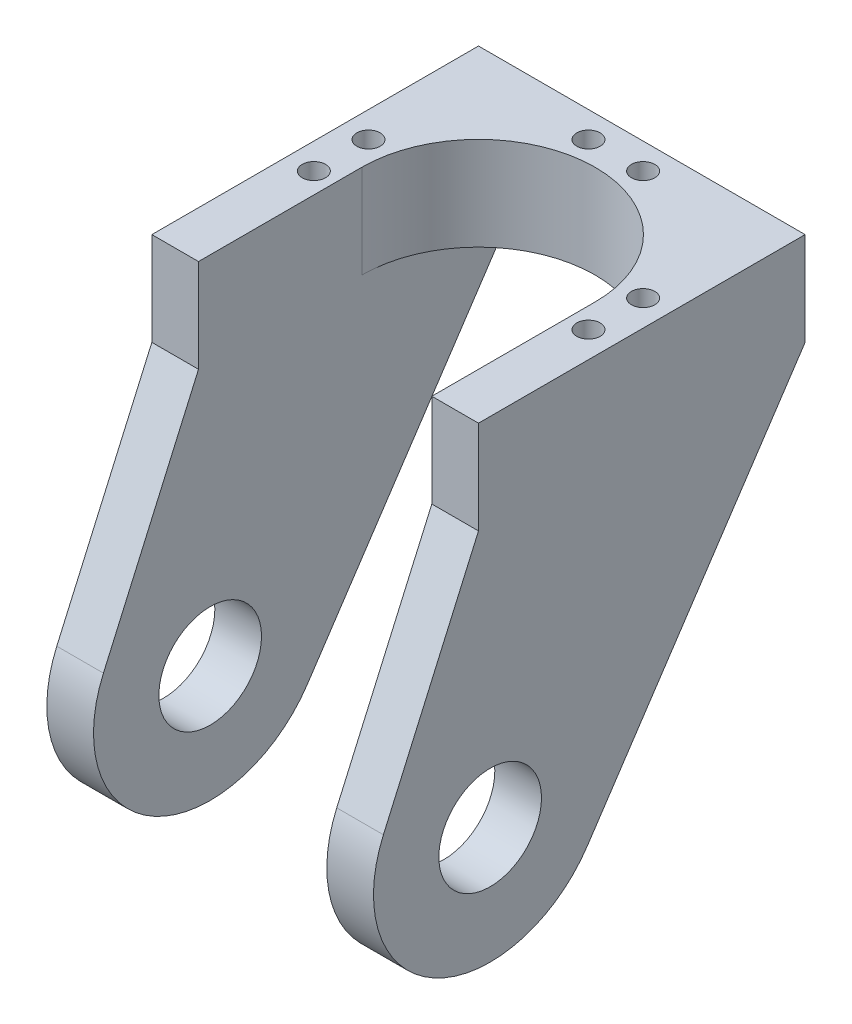
ISO-10303-21;
HEADER;
FILE_DESCRIPTION(('STEP AP214'),'2;1');
FILE_NAME('part.step','',(''),(''),'','','');
FILE_SCHEMA(('AUTOMOTIVE_DESIGN { 1 0 10303 214 1 1 1 1 }'));
ENDSEC;
DATA;
#1=APPLICATION_CONTEXT('core data for automotive mechanical design processes');
#2=APPLICATION_PROTOCOL_DEFINITION('international standard','automotive_design',2000,#1);
#3=PRODUCT_CONTEXT('',#1,'mechanical');
#4=PRODUCT('Part','Part','',(#3));
#5=PRODUCT_RELATED_PRODUCT_CATEGORY('part','',(#4));
#6=PRODUCT_DEFINITION_FORMATION('','',#4);
#7=PRODUCT_DEFINITION_CONTEXT('part definition',#1,'design');
#8=PRODUCT_DEFINITION('design','',#6,#7);
#9=PRODUCT_DEFINITION_SHAPE('','',#8);
#10=(LENGTH_UNIT() NAMED_UNIT(*) SI_UNIT(.MILLI.,.METRE.));
#11=(NAMED_UNIT(*) PLANE_ANGLE_UNIT() SI_UNIT($,.RADIAN.));
#12=(NAMED_UNIT(*) SI_UNIT($,.STERADIAN.) SOLID_ANGLE_UNIT());
#13=UNCERTAINTY_MEASURE_WITH_UNIT(LENGTH_MEASURE(1.E-05),#10,'distance_accuracy_value','');
#14=(GEOMETRIC_REPRESENTATION_CONTEXT(3) GLOBAL_UNCERTAINTY_ASSIGNED_CONTEXT((#13)) GLOBAL_UNIT_ASSIGNED_CONTEXT((#10,
#11,#12)) REPRESENTATION_CONTEXT('',''));
#15=CARTESIAN_POINT('',(0.,0.,0.));
#16=DIRECTION('',(0.,0.,1.));
#17=DIRECTION('',(1.,0.,0.));
#18=AXIS2_PLACEMENT_3D('',#15,#16,#17);
#19=CARTESIAN_POINT('',(-35.,-56.2916512459886,32.4999999999999));
#20=DIRECTION('',(1.,0.,0.));
#21=DIRECTION('',(0.,0.,-1.));
#22=AXIS2_PLACEMENT_3D('',#19,#20,#21);
#23=CYLINDRICAL_SURFACE('',#22,11.);
#24=CARTESIAN_POINT('',(35.,-56.2916512459886,32.4999999999999));
#25=DIRECTION('',(1.,0.,0.));
#26=DIRECTION('',(0.,0.,-1.));
#27=AXIS2_PLACEMENT_3D('',#24,#25,#26);
#28=CIRCLE('',#27,11.);
#29=CARTESIAN_POINT('',(35.,-56.2916512459886,21.4999999999999));
#30=VERTEX_POINT('',#29);
#31=EDGE_CURVE('E272',#30,#30,#28,.T.);
#32=ORIENTED_EDGE('',*,*,#31,.T.);
#33=EDGE_LOOP('',(#32));
#34=FACE_BOUND('',#33,.T.);
#35=CARTESIAN_POINT('',(25.,-56.2916512459886,32.4999999999999));
#36=DIRECTION('',(-1.,0.,0.));
#37=DIRECTION('',(0.,-1.,0.));
#38=AXIS2_PLACEMENT_3D('',#35,#36,#37);
#39=CIRCLE('',#38,11.);
#40=CARTESIAN_POINT('',(25.,-67.2916512459886,32.4999999999999));
#41=VERTEX_POINT('',#40);
#42=EDGE_CURVE('E165',#41,#41,#39,.F.);
#43=ORIENTED_EDGE('',*,*,#42,.F.);
#44=EDGE_LOOP('',(#43));
#45=FACE_BOUND('',#44,.T.);
#46=ADVANCED_FACE('F35',(#34,#45),#23,.F.);
#47=CARTESIAN_POINT('',(-35.,-56.2916512459886,32.4999999999999));
#48=DIRECTION('',(1.,0.,0.));
#49=DIRECTION('',(0.,0.,-1.));
#50=AXIS2_PLACEMENT_3D('',#47,#48,#49);
#51=CYLINDRICAL_SURFACE('',#50,25.);
#52=DIRECTION('',(1.,0.,0.));
#53=VECTOR('',#52,1.);
#54=CARTESIAN_POINT('',(-35.,-46.2046632977982,55.3747169191895));
#55=LINE('',#54,#53);
#56=CARTESIAN_POINT('',(25.,-46.2046632977982,55.3747169191895));
#57=VERTEX_POINT('',#56);
#58=CARTESIAN_POINT('',(35.,-46.2046632977982,55.3747169191895));
#59=VERTEX_POINT('',#58);
#60=EDGE_CURVE('E270',#57,#59,#55,.T.);
#61=ORIENTED_EDGE('',*,*,#60,.F.);
#62=CARTESIAN_POINT('',(25.,-56.2916512459886,32.4999999999999));
#63=DIRECTION('',(-1.,0.,0.));
#64=DIRECTION('',(0.,-1.,0.));
#65=AXIS2_PLACEMENT_3D('',#62,#63,#64);
#66=CIRCLE('',#65,25.);
#67=CARTESIAN_POINT('',(25.,-70.1439483843197,11.6886121560481));
#68=VERTEX_POINT('',#67);
#69=EDGE_CURVE('E210',#57,#68,#66,.F.);
#70=ORIENTED_EDGE('',*,*,#69,.T.);
#71=DIRECTION('',(1.,0.,0.));
#72=VECTOR('',#71,1.);
#73=CARTESIAN_POINT('',(-35.,-70.1439483843197,11.6886121560481));
#74=LINE('',#73,#72);
#75=CARTESIAN_POINT('',(35.,-70.1439483843197,11.6886121560481));
#76=VERTEX_POINT('',#75);
#77=EDGE_CURVE('E269',#68,#76,#74,.T.);
#78=ORIENTED_EDGE('',*,*,#77,.T.);
#79=CARTESIAN_POINT('',(35.,-56.2916512459886,32.4999999999999));
#80=DIRECTION('',(1.,0.,0.));
#81=DIRECTION('',(0.,0.,-1.));
#82=AXIS2_PLACEMENT_3D('',#79,#80,#81);
#83=CIRCLE('',#82,25.);
#84=EDGE_CURVE('E279',#59,#76,#83,.T.);
#85=ORIENTED_EDGE('',*,*,#84,.F.);
#86=EDGE_LOOP('',(#61,#70,#78,#85));
#87=FACE_BOUND('',#86,.T.);
#88=ADVANCED_FACE('F327',(#87),#51,.T.);
#89=CARTESIAN_POINT('',(-35.,-16.1439895834264,-24.2543763835175));
#90=DIRECTION('',(0.,0.554091885533245,0.832455513758071));
#91=DIRECTION('',(0.,-0.832455513758071,0.554091885533245));
#92=AXIS2_PLACEMENT_3D('',#89,#90,#91);
#93=PLANE('',#92);
#94=DIRECTION('',(0.,-0.832455513758071,0.554091885533245));
#95=VECTOR('',#94,1.);
#96=CARTESIAN_POINT('',(25.,-16.1439895834264,-24.2543763835175));
#97=LINE('',#96,#95);
#98=CARTESIAN_POINT('',(25.,0.,-35.));
#99=VERTEX_POINT('',#98);
#100=EDGE_CURVE('E293',#99,#68,#97,.T.);
#101=ORIENTED_EDGE('',*,*,#100,.F.);
#102=DIRECTION('',(1.,0.,0.));
#103=VECTOR('',#102,1.);
#104=CARTESIAN_POINT('',(0.,0.,-35.));
#105=LINE('',#104,#103);
#106=CARTESIAN_POINT('',(35.,0.,-35.));
#107=VERTEX_POINT('',#106);
#108=EDGE_CURVE('E163',#99,#107,#105,.T.);
#109=ORIENTED_EDGE('',*,*,#108,.T.);
#110=DIRECTION('',(0.,-0.832455513758071,0.554091885533245));
#111=VECTOR('',#110,1.);
#112=CARTESIAN_POINT('',(35.,-16.1439895834264,-24.2543763835175));
#113=LINE('',#112,#111);
#114=EDGE_CURVE('E276',#107,#76,#113,.T.);
#115=ORIENTED_EDGE('',*,*,#114,.T.);
#116=ORIENTED_EDGE('',*,*,#77,.F.);
#117=EDGE_LOOP('',(#101,#109,#115,#116));
#118=FACE_BOUND('',#117,.T.);
#119=ADVANCED_FACE('F325',(#118),#93,.F.);
#120=CARTESIAN_POINT('',(-35.,12.9212716573994,29.3021497514515));
#121=DIRECTION('',(0.,-0.403479517927615,-0.914988676767587));
#122=DIRECTION('',(0.,0.914988676767587,-0.403479517927615));
#123=AXIS2_PLACEMENT_3D('',#120,#121,#122);
#124=PLANE('',#123);
#125=DIRECTION('',(0.,0.914988676767587,-0.403479517927615));
#126=VECTOR('',#125,1.);
#127=CARTESIAN_POINT('',(25.,12.9212716573994,29.3021497514515));
#128=LINE('',#127,#126);
#129=CARTESIAN_POINT('',(25.,0.,35.));
#130=VERTEX_POINT('',#129);
#131=EDGE_CURVE('E208',#57,#130,#128,.T.);
#132=ORIENTED_EDGE('',*,*,#131,.F.);
#133=ORIENTED_EDGE('',*,*,#60,.T.);
#134=DIRECTION('',(0.,0.914988676767587,-0.403479517927615));
#135=VECTOR('',#134,1.);
#136=CARTESIAN_POINT('',(35.,12.9212716573994,29.3021497514515));
#137=LINE('',#136,#135);
#138=CARTESIAN_POINT('',(35.,0.,35.));
#139=VERTEX_POINT('',#138);
#140=EDGE_CURVE('E216',#59,#139,#137,.T.);
#141=ORIENTED_EDGE('',*,*,#140,.T.);
#142=DIRECTION('',(1.,0.,0.));
#143=VECTOR('',#142,1.);
#144=CARTESIAN_POINT('',(0.,0.,35.));
#145=LINE('',#144,#143);
#146=EDGE_CURVE('E175',#130,#139,#145,.T.);
#147=ORIENTED_EDGE('',*,*,#146,.F.);
#148=EDGE_LOOP('',(#132,#133,#141,#147));
#149=FACE_BOUND('',#148,.T.);
#150=ADVANCED_FACE('F214',(#149),#124,.F.);
#151=CARTESIAN_POINT('',(0.,20.,0.));
#152=DIRECTION('',(0.,-1.,0.));
#153=DIRECTION('',(0.,0.,-1.));
#154=AXIS2_PLACEMENT_3D('',#151,#152,#153);
#155=CYLINDRICAL_SURFACE('',#154,25.);
#156=CARTESIAN_POINT('',(0.,0.,0.));
#157=DIRECTION('',(0.,1.,0.));
#158=DIRECTION('',(0.,0.,1.));
#159=AXIS2_PLACEMENT_3D('',#156,#157,#158);
#160=CIRCLE('',#159,25.);
#161=CARTESIAN_POINT('',(25.,0.,0.));
#162=VERTEX_POINT('',#161);
#163=CARTESIAN_POINT('',(-25.,0.,0.));
#164=VERTEX_POINT('',#163);
#165=EDGE_CURVE('E153',#162,#164,#160,.T.);
#166=ORIENTED_EDGE('',*,*,#165,.F.);
#167=DIRECTION('',(0.,-1.,0.));
#168=VECTOR('',#167,1.);
#169=CARTESIAN_POINT('',(25.,20.,0.));
#170=LINE('',#169,#168);
#171=CARTESIAN_POINT('',(25.,20.,0.));
#172=VERTEX_POINT('',#171);
#173=EDGE_CURVE('E11',#172,#162,#170,.T.);
#174=ORIENTED_EDGE('',*,*,#173,.F.);
#175=CARTESIAN_POINT('',(0.,20.,0.));
#176=DIRECTION('',(0.,1.,0.));
#177=DIRECTION('',(0.,0.,1.));
#178=AXIS2_PLACEMENT_3D('',#175,#176,#177);
#179=CIRCLE('',#178,25.);
#180=CARTESIAN_POINT('',(-25.,20.,0.));
#181=VERTEX_POINT('',#180);
#182=EDGE_CURVE('E247',#172,#181,#179,.T.);
#183=ORIENTED_EDGE('',*,*,#182,.T.);
#184=DIRECTION('',(0.,-1.,0.));
#185=VECTOR('',#184,1.);
#186=CARTESIAN_POINT('',(-25.,20.,0.));
#187=LINE('',#186,#185);
#188=EDGE_CURVE('E50',#181,#164,#187,.T.);
#189=ORIENTED_EDGE('',*,*,#188,.T.);
#190=EDGE_LOOP('',(#166,#174,#183,#189));
#191=FACE_BOUND('',#190,.T.);
#192=ADVANCED_FACE('F302',(#191),#155,.F.);
#193=CARTESIAN_POINT('',(25.,20.,0.));
#194=DIRECTION('',(1.,0.,0.));
#195=DIRECTION('',(0.,0.,-1.));
#196=AXIS2_PLACEMENT_3D('',#193,#194,#195);
#197=PLANE('',#196);
#198=ORIENTED_EDGE('',*,*,#173,.T.);
#199=DIRECTION('',(0.,0.,1.));
#200=VECTOR('',#199,1.);
#201=CARTESIAN_POINT('',(25.,0.,-102.));
#202=LINE('',#201,#200);
#203=EDGE_CURVE('E155',#99,#162,#202,.T.);
#204=ORIENTED_EDGE('',*,*,#203,.F.);
#205=ORIENTED_EDGE('',*,*,#100,.T.);
#206=ORIENTED_EDGE('',*,*,#69,.F.);
#207=ORIENTED_EDGE('',*,*,#131,.T.);
#208=DIRECTION('',(0.,-1.,0.));
#209=VECTOR('',#208,1.);
#210=CARTESIAN_POINT('',(25.,20.,35.));
#211=LINE('',#210,#209);
#212=CARTESIAN_POINT('',(25.,20.,35.));
#213=VERTEX_POINT('',#212);
#214=EDGE_CURVE('E43',#213,#130,#211,.T.);
#215=ORIENTED_EDGE('',*,*,#214,.F.);
#216=DIRECTION('',(0.,0.,1.));
#217=VECTOR('',#216,1.);
#218=CARTESIAN_POINT('',(25.,20.,0.));
#219=LINE('',#218,#217);
#220=EDGE_CURVE('E205',#172,#213,#219,.T.);
#221=ORIENTED_EDGE('',*,*,#220,.F.);
#222=EDGE_LOOP('',(#198,#204,#205,#206,#207,#215,#221));
#223=FACE_BOUND('',#222,.T.);
#224=ORIENTED_EDGE('',*,*,#42,.T.);
#225=EDGE_LOOP('',(#224));
#226=FACE_BOUND('',#225,.T.);
#227=ADVANCED_FACE('F203',(#223,#226),#197,.F.);
#228=CARTESIAN_POINT('',(0.,20.,35.));
#229=DIRECTION('',(0.,0.,-1.));
#230=DIRECTION('',(-1.,0.,0.));
#231=AXIS2_PLACEMENT_3D('',#228,#229,#230);
#232=PLANE('',#231);
#233=ORIENTED_EDGE('',*,*,#146,.T.);
#234=DIRECTION('',(0.,-1.,0.));
#235=VECTOR('',#234,1.);
#236=CARTESIAN_POINT('',(35.,20.,35.));
#237=LINE('',#236,#235);
#238=CARTESIAN_POINT('',(35.,20.,35.));
#239=VERTEX_POINT('',#238);
#240=EDGE_CURVE('E189',#239,#139,#237,.T.);
#241=ORIENTED_EDGE('',*,*,#240,.F.);
#242=DIRECTION('',(1.,0.,0.));
#243=VECTOR('',#242,1.);
#244=CARTESIAN_POINT('',(0.,20.,35.));
#245=LINE('',#244,#243);
#246=EDGE_CURVE('E199',#213,#239,#245,.T.);
#247=ORIENTED_EDGE('',*,*,#246,.F.);
#248=ORIENTED_EDGE('',*,*,#214,.T.);
#249=EDGE_LOOP('',(#233,#241,#247,#248));
#250=FACE_BOUND('',#249,.T.);
#251=ADVANCED_FACE('F195',(#250),#232,.F.);
#252=CARTESIAN_POINT('',(35.,20.,0.));
#253=DIRECTION('',(-1.,0.,0.));
#254=DIRECTION('',(0.,0.,1.));
#255=AXIS2_PLACEMENT_3D('',#252,#253,#254);
#256=PLANE('',#255);
#257=ORIENTED_EDGE('',*,*,#240,.T.);
#258=ORIENTED_EDGE('',*,*,#140,.F.);
#259=ORIENTED_EDGE('',*,*,#84,.T.);
#260=ORIENTED_EDGE('',*,*,#114,.F.);
#261=DIRECTION('',(0.,-1.,0.));
#262=VECTOR('',#261,1.);
#263=CARTESIAN_POINT('',(35.,20.,-35.));
#264=LINE('',#263,#262);
#265=CARTESIAN_POINT('',(35.,20.,-35.));
#266=VERTEX_POINT('',#265);
#267=EDGE_CURVE('E187',#266,#107,#264,.T.);
#268=ORIENTED_EDGE('',*,*,#267,.F.);
#269=DIRECTION('',(0.,0.,-1.));
#270=VECTOR('',#269,1.);
#271=CARTESIAN_POINT('',(35.,20.,0.));
#272=LINE('',#271,#270);
#273=EDGE_CURVE('E243',#239,#266,#272,.T.);
#274=ORIENTED_EDGE('',*,*,#273,.F.);
#275=EDGE_LOOP('',(#257,#258,#259,#260,#268,#274));
#276=FACE_BOUND('',#275,.T.);
#277=ORIENTED_EDGE('',*,*,#31,.F.);
#278=EDGE_LOOP('',(#277));
#279=FACE_BOUND('',#278,.T.);
#280=ADVANCED_FACE('F320',(#276,#279),#256,.F.);
#281=CARTESIAN_POINT('',(0.,20.,-35.));
#282=DIRECTION('',(0.,0.,-1.));
#283=DIRECTION('',(-1.,0.,0.));
#284=AXIS2_PLACEMENT_3D('',#281,#282,#283);
#285=PLANE('',#284);
#286=CARTESIAN_POINT('',(-35.,0.,-35.));
#287=VERTEX_POINT('',#286);
#288=CARTESIAN_POINT('',(-25.,0.,-35.));
#289=VERTEX_POINT('',#288);
#290=EDGE_CURVE('E161',#287,#289,#105,.T.);
#291=ORIENTED_EDGE('',*,*,#290,.F.);
#292=DIRECTION('',(0.,-1.,0.));
#293=VECTOR('',#292,1.);
#294=CARTESIAN_POINT('',(-35.,20.,-35.));
#295=LINE('',#294,#293);
#296=CARTESIAN_POINT('',(-35.,20.,-35.));
#297=VERTEX_POINT('',#296);
#298=EDGE_CURVE('E185',#297,#287,#295,.T.);
#299=ORIENTED_EDGE('',*,*,#298,.F.);
#300=DIRECTION('',(1.,0.,0.));
#301=VECTOR('',#300,1.);
#302=CARTESIAN_POINT('',(0.,20.,-35.));
#303=LINE('',#302,#301);
#304=EDGE_CURVE('E240',#297,#266,#303,.T.);
#305=ORIENTED_EDGE('',*,*,#304,.T.);
#306=ORIENTED_EDGE('',*,*,#267,.T.);
#307=ORIENTED_EDGE('',*,*,#108,.F.);
#308=DIRECTION('',(1.,0.,0.));
#309=VECTOR('',#308,1.);
#310=CARTESIAN_POINT('',(-35.,0.,-35.));
#311=LINE('',#310,#309);
#312=EDGE_CURVE('E150',#289,#99,#311,.T.);
#313=ORIENTED_EDGE('',*,*,#312,.F.);
#314=EDGE_LOOP('',(#291,#299,#305,#306,#307,#313));
#315=FACE_BOUND('',#314,.T.);
#316=ADVANCED_FACE('F160',(#315),#285,.T.);
#317=CARTESIAN_POINT('',(-35.,20.,0.));
#318=DIRECTION('',(-1.,0.,0.));
#319=DIRECTION('',(0.,0.,1.));
#320=AXIS2_PLACEMENT_3D('',#317,#318,#319);
#321=PLANE('',#320);
#322=ORIENTED_EDGE('',*,*,#298,.T.);
#323=DIRECTION('',(0.,-0.832455513758071,0.554091885533245));
#324=VECTOR('',#323,1.);
#325=CARTESIAN_POINT('',(-35.,-16.1439895834264,-24.2543763835175));
#326=LINE('',#325,#324);
#327=CARTESIAN_POINT('',(-35.,-70.1439483843197,11.6886121560481));
#328=VERTEX_POINT('',#327);
#329=EDGE_CURVE('E168',#287,#328,#326,.T.);
#330=ORIENTED_EDGE('',*,*,#329,.T.);
#331=CARTESIAN_POINT('',(-35.,-56.2916512459886,32.4999999999999));
#332=DIRECTION('',(1.,0.,0.));
#333=DIRECTION('',(0.,0.,-1.));
#334=AXIS2_PLACEMENT_3D('',#331,#332,#333);
#335=CIRCLE('',#334,25.);
#336=CARTESIAN_POINT('',(-35.,-46.2046632977982,55.3747169191895));
#337=VERTEX_POINT('',#336);
#338=EDGE_CURVE('E287',#337,#328,#335,.T.);
#339=ORIENTED_EDGE('',*,*,#338,.F.);
#340=DIRECTION('',(0.,0.914988676767587,-0.403479517927615));
#341=VECTOR('',#340,1.);
#342=CARTESIAN_POINT('',(-35.,12.9212716573994,29.3021497514515));
#343=LINE('',#342,#341);
#344=CARTESIAN_POINT('',(-35.,0.,35.));
#345=VERTEX_POINT('',#344);
#346=EDGE_CURVE('E275',#337,#345,#343,.T.);
#347=ORIENTED_EDGE('',*,*,#346,.T.);
#348=DIRECTION('',(0.,-1.,0.));
#349=VECTOR('',#348,1.);
#350=CARTESIAN_POINT('',(-35.,20.,35.));
#351=LINE('',#350,#349);
#352=CARTESIAN_POINT('',(-35.,20.,35.));
#353=VERTEX_POINT('',#352);
#354=EDGE_CURVE('E182',#353,#345,#351,.T.);
#355=ORIENTED_EDGE('',*,*,#354,.F.);
#356=DIRECTION('',(0.,0.,-1.));
#357=VECTOR('',#356,1.);
#358=CARTESIAN_POINT('',(-35.,20.,0.));
#359=LINE('',#358,#357);
#360=EDGE_CURVE('E237',#353,#297,#359,.T.);
#361=ORIENTED_EDGE('',*,*,#360,.T.);
#362=EDGE_LOOP('',(#322,#330,#339,#347,#355,#361));
#363=FACE_BOUND('',#362,.T.);
#364=CARTESIAN_POINT('',(-35.,-56.2916512459886,32.4999999999999));
#365=DIRECTION('',(1.,0.,0.));
#366=DIRECTION('',(0.,0.,-1.));
#367=AXIS2_PLACEMENT_3D('',#364,#365,#366);
#368=CIRCLE('',#367,11.);
#369=CARTESIAN_POINT('',(-35.,-56.2916512459886,21.4999999999999));
#370=VERTEX_POINT('',#369);
#371=EDGE_CURVE('E283',#370,#370,#368,.T.);
#372=ORIENTED_EDGE('',*,*,#371,.T.);
#373=EDGE_LOOP('',(#372));
#374=FACE_BOUND('',#373,.T.);
#375=ADVANCED_FACE('F314',(#363,#374),#321,.T.);
#376=CARTESIAN_POINT('',(-25.,0.,35.));
#377=VERTEX_POINT('',#376);
#378=EDGE_CURVE('E170',#345,#377,#145,.T.);
#379=ORIENTED_EDGE('',*,*,#378,.T.);
#380=DIRECTION('',(0.,-1.,0.));
#381=VECTOR('',#380,1.);
#382=CARTESIAN_POINT('',(-25.,20.,35.));
#383=LINE('',#382,#381);
#384=CARTESIAN_POINT('',(-25.,20.,35.));
#385=VERTEX_POINT('',#384);
#386=EDGE_CURVE('E179',#385,#377,#383,.T.);
#387=ORIENTED_EDGE('',*,*,#386,.F.);
#388=EDGE_CURVE('E58',#353,#385,#245,.T.);
#389=ORIENTED_EDGE('',*,*,#388,.F.);
#390=ORIENTED_EDGE('',*,*,#354,.T.);
#391=EDGE_LOOP('',(#379,#387,#389,#390));
#392=FACE_BOUND('',#391,.T.);
#393=ADVANCED_FACE('F306',(#392),#232,.F.);
#394=CARTESIAN_POINT('',(-5.85270966048376,20.,-29.4235584120969));
#395=DIRECTION('',(0.,-1.,0.));
#396=DIRECTION('',(0.,0.,-1.));
#397=AXIS2_PLACEMENT_3D('',#394,#395,#396);
#398=CYLINDRICAL_SURFACE('',#397,2.5);
#399=CARTESIAN_POINT('',(-5.85270966048376,20.,-29.4235584120969));
#400=DIRECTION('',(0.,1.,0.));
#401=DIRECTION('',(0.,0.,1.));
#402=AXIS2_PLACEMENT_3D('',#399,#400,#401);
#403=CIRCLE('',#402,2.5);
#404=CARTESIAN_POINT('',(-5.85270966048376,20.,-26.9235584120969));
#405=VERTEX_POINT('',#404);
#406=EDGE_CURVE('E249',#405,#405,#403,.T.);
#407=ORIENTED_EDGE('',*,*,#406,.T.);
#408=EDGE_LOOP('',(#407));
#409=FACE_BOUND('',#408,.T.);
#410=CARTESIAN_POINT('',(-5.85270966048376,0.,-29.4235584120969));
#411=DIRECTION('',(0.,1.,0.));
#412=DIRECTION('',(0.,0.,1.));
#413=AXIS2_PLACEMENT_3D('',#410,#411,#412);
#414=CIRCLE('',#413,2.5);
#415=CARTESIAN_POINT('',(-5.85270966048376,0.,-26.9235584120969));
#416=VERTEX_POINT('',#415);
#417=EDGE_CURVE('E222',#416,#416,#414,.T.);
#418=ORIENTED_EDGE('',*,*,#417,.F.);
#419=EDGE_LOOP('',(#418));
#420=FACE_BOUND('',#419,.T.);
#421=ADVANCED_FACE('F386',(#409,#420),#398,.F.);
#422=CARTESIAN_POINT('',(5.85270966048358,20.,-29.4235584120973));
#423=DIRECTION('',(0.,-1.,0.));
#424=DIRECTION('',(0.,0.,-1.));
#425=AXIS2_PLACEMENT_3D('',#422,#423,#424);
#426=CYLINDRICAL_SURFACE('',#425,2.5);
#427=CARTESIAN_POINT('',(5.85270966048358,20.,-29.4235584120973));
#428=DIRECTION('',(0.,1.,0.));
#429=DIRECTION('',(0.,0.,1.));
#430=AXIS2_PLACEMENT_3D('',#427,#428,#429);
#431=CIRCLE('',#430,2.5);
#432=CARTESIAN_POINT('',(5.85270966048358,20.,-26.9235584120973));
#433=VERTEX_POINT('',#432);
#434=EDGE_CURVE('E252',#433,#433,#431,.T.);
#435=ORIENTED_EDGE('',*,*,#434,.T.);
#436=EDGE_LOOP('',(#435));
#437=FACE_BOUND('',#436,.T.);
#438=CARTESIAN_POINT('',(5.85270966048358,0.,-29.4235584120973));
#439=DIRECTION('',(0.,1.,0.));
#440=DIRECTION('',(0.,0.,1.));
#441=AXIS2_PLACEMENT_3D('',#438,#439,#440);
#442=CIRCLE('',#441,2.5);
#443=CARTESIAN_POINT('',(5.85270966048358,0.,-26.9235584120973));
#444=VERTEX_POINT('',#443);
#445=EDGE_CURVE('E164',#444,#444,#442,.T.);
#446=ORIENTED_EDGE('',*,*,#445,.F.);
#447=EDGE_LOOP('',(#446));
#448=FACE_BOUND('',#447,.T.);
#449=ADVANCED_FACE('F376',(#437,#448),#426,.F.);
#450=CARTESIAN_POINT('',(29.4235584120966,20.,-5.85270966048553));
#451=DIRECTION('',(0.,-1.,0.));
#452=DIRECTION('',(0.,0.,-1.));
#453=AXIS2_PLACEMENT_3D('',#450,#451,#452);
#454=CYLINDRICAL_SURFACE('',#453,2.5);
#455=CARTESIAN_POINT('',(29.4235584120966,20.,-5.85270966048553));
#456=DIRECTION('',(0.,1.,0.));
#457=DIRECTION('',(0.,0.,1.));
#458=AXIS2_PLACEMENT_3D('',#455,#456,#457);
#459=CIRCLE('',#458,2.5);
#460=CARTESIAN_POINT('',(29.4235584120966,20.,-3.35270966048553));
#461=VERTEX_POINT('',#460);
#462=EDGE_CURVE('E255',#461,#461,#459,.T.);
#463=ORIENTED_EDGE('',*,*,#462,.T.);
#464=EDGE_LOOP('',(#463));
#465=FACE_BOUND('',#464,.T.);
#466=CARTESIAN_POINT('',(29.4235584120966,0.,-5.85270966048553));
#467=DIRECTION('',(0.,1.,0.));
#468=DIRECTION('',(0.,0.,1.));
#469=AXIS2_PLACEMENT_3D('',#466,#467,#468);
#470=CIRCLE('',#469,2.5);
#471=CARTESIAN_POINT('',(29.4235584120966,0.,-3.35270966048553));
#472=VERTEX_POINT('',#471);
#473=EDGE_CURVE('E217',#472,#472,#470,.T.);
#474=ORIENTED_EDGE('',*,*,#473,.F.);
#475=EDGE_LOOP('',(#474));
#476=FACE_BOUND('',#475,.T.);
#477=ADVANCED_FACE('F373',(#465,#476),#454,.F.);
#478=CARTESIAN_POINT('',(29.4235584120969,20.,5.85270966048181));
#479=DIRECTION('',(0.,-1.,0.));
#480=DIRECTION('',(0.,0.,-1.));
#481=AXIS2_PLACEMENT_3D('',#478,#479,#480);
#482=CYLINDRICAL_SURFACE('',#481,2.5);
#483=CARTESIAN_POINT('',(29.4235584120969,20.,5.85270966048181));
#484=DIRECTION('',(0.,1.,0.));
#485=DIRECTION('',(0.,0.,1.));
#486=AXIS2_PLACEMENT_3D('',#483,#484,#485);
#487=CIRCLE('',#486,2.5);
#488=CARTESIAN_POINT('',(29.4235584120969,20.,8.35270966048181));
#489=VERTEX_POINT('',#488);
#490=EDGE_CURVE('E258',#489,#489,#487,.T.);
#491=ORIENTED_EDGE('',*,*,#490,.T.);
#492=EDGE_LOOP('',(#491));
#493=FACE_BOUND('',#492,.T.);
#494=CARTESIAN_POINT('',(29.4235584120969,0.,5.85270966048181));
#495=DIRECTION('',(0.,1.,0.));
#496=DIRECTION('',(0.,0.,1.));
#497=AXIS2_PLACEMENT_3D('',#494,#495,#496);
#498=CIRCLE('',#497,2.5);
#499=CARTESIAN_POINT('',(29.4235584120969,0.,8.35270966048181));
#500=VERTEX_POINT('',#499);
#501=EDGE_CURVE('E219',#500,#500,#498,.T.);
#502=ORIENTED_EDGE('',*,*,#501,.F.);
#503=EDGE_LOOP('',(#502));
#504=FACE_BOUND('',#503,.T.);
#505=ADVANCED_FACE('F375',(#493,#504),#482,.F.);
#506=CARTESIAN_POINT('',(-29.4235584120952,20.,5.85270966048343));
#507=DIRECTION('',(0.,-1.,0.));
#508=DIRECTION('',(0.,0.,-1.));
#509=AXIS2_PLACEMENT_3D('',#506,#507,#508);
#510=CYLINDRICAL_SURFACE('',#509,2.5);
#511=CARTESIAN_POINT('',(-29.4235584120952,20.,5.85270966048343));
#512=DIRECTION('',(0.,1.,0.));
#513=DIRECTION('',(0.,0.,1.));
#514=AXIS2_PLACEMENT_3D('',#511,#512,#513);
#515=CIRCLE('',#514,2.5);
#516=CARTESIAN_POINT('',(-29.4235584120952,20.,8.35270966048343));
#517=VERTEX_POINT('',#516);
#518=EDGE_CURVE('E261',#517,#517,#515,.T.);
#519=ORIENTED_EDGE('',*,*,#518,.T.);
#520=EDGE_LOOP('',(#519));
#521=FACE_BOUND('',#520,.T.);
#522=CARTESIAN_POINT('',(-29.4235584120952,0.,5.85270966048343));
#523=DIRECTION('',(0.,1.,0.));
#524=DIRECTION('',(0.,0.,1.));
#525=AXIS2_PLACEMENT_3D('',#522,#523,#524);
#526=CIRCLE('',#525,2.5);
#527=CARTESIAN_POINT('',(-29.4235584120952,0.,8.35270966048343));
#528=VERTEX_POINT('',#527);
#529=EDGE_CURVE('E229',#528,#528,#526,.T.);
#530=ORIENTED_EDGE('',*,*,#529,.F.);
#531=EDGE_LOOP('',(#530));
#532=FACE_BOUND('',#531,.T.);
#533=ADVANCED_FACE('F383',(#521,#532),#510,.F.);
#534=CARTESIAN_POINT('',(-29.4235584120955,20.,-5.85270966048393));
#535=DIRECTION('',(0.,-1.,0.));
#536=DIRECTION('',(0.,0.,-1.));
#537=AXIS2_PLACEMENT_3D('',#534,#535,#536);
#538=CYLINDRICAL_SURFACE('',#537,2.50000000000012);
#539=CARTESIAN_POINT('',(-29.4235584120955,20.,-5.85270966048393));
#540=DIRECTION('',(0.,1.,0.));
#541=DIRECTION('',(0.,0.,1.));
#542=AXIS2_PLACEMENT_3D('',#539,#540,#541);
#543=CIRCLE('',#542,2.50000000000012);
#544=CARTESIAN_POINT('',(-29.4235584120955,20.,-3.35270966048381));
#545=VERTEX_POINT('',#544);
#546=EDGE_CURVE('E173',#545,#545,#543,.T.);
#547=ORIENTED_EDGE('',*,*,#546,.T.);
#548=EDGE_LOOP('',(#547));
#549=FACE_BOUND('',#548,.T.);
#550=CARTESIAN_POINT('',(-29.4235584120955,0.,-5.85270966048393));
#551=DIRECTION('',(0.,1.,0.));
#552=DIRECTION('',(0.,0.,1.));
#553=AXIS2_PLACEMENT_3D('',#550,#551,#552);
#554=CIRCLE('',#553,2.50000000000012);
#555=CARTESIAN_POINT('',(-29.4235584120955,0.,-3.35270966048381));
#556=VERTEX_POINT('',#555);
#557=EDGE_CURVE('E232',#556,#556,#554,.T.);
#558=ORIENTED_EDGE('',*,*,#557,.F.);
#559=EDGE_LOOP('',(#558));
#560=FACE_BOUND('',#559,.T.);
#561=ADVANCED_FACE('F37',(#549,#560),#538,.F.);
#562=CARTESIAN_POINT('',(-25.,20.,0.));
#563=DIRECTION('',(1.,0.,0.));
#564=DIRECTION('',(0.,0.,-1.));
#565=AXIS2_PLACEMENT_3D('',#562,#563,#564);
#566=PLANE('',#565);
#567=ORIENTED_EDGE('',*,*,#386,.T.);
#568=DIRECTION('',(0.,0.914988676767587,-0.403479517927615));
#569=VECTOR('',#568,1.);
#570=CARTESIAN_POINT('',(-25.,12.9212716573994,29.3021497514515));
#571=LINE('',#570,#569);
#572=CARTESIAN_POINT('',(-25.,-46.2046632977982,55.3747169191895));
#573=VERTEX_POINT('',#572);
#574=EDGE_CURVE('E154',#573,#377,#571,.T.);
#575=ORIENTED_EDGE('',*,*,#574,.F.);
#576=CARTESIAN_POINT('',(-25.,-56.2916512459886,32.4999999999999));
#577=DIRECTION('',(-1.,0.,0.));
#578=DIRECTION('',(0.,-1.,0.));
#579=AXIS2_PLACEMENT_3D('',#576,#577,#578);
#580=CIRCLE('',#579,25.);
#581=CARTESIAN_POINT('',(-25.,-70.1439483843197,11.6886121560481));
#582=VERTEX_POINT('',#581);
#583=EDGE_CURVE('E139',#573,#582,#580,.F.);
#584=ORIENTED_EDGE('',*,*,#583,.T.);
#585=DIRECTION('',(0.,-0.832455513758071,0.554091885533245));
#586=VECTOR('',#585,1.);
#587=CARTESIAN_POINT('',(-25.,-16.1439895834264,-24.2543763835175));
#588=LINE('',#587,#586);
#589=EDGE_CURVE('E131',#289,#582,#588,.T.);
#590=ORIENTED_EDGE('',*,*,#589,.F.);
#591=DIRECTION('',(0.,0.,1.));
#592=VECTOR('',#591,1.);
#593=CARTESIAN_POINT('',(-25.,0.,-102.));
#594=LINE('',#593,#592);
#595=EDGE_CURVE('E136',#289,#164,#594,.T.);
#596=ORIENTED_EDGE('',*,*,#595,.T.);
#597=ORIENTED_EDGE('',*,*,#188,.F.);
#598=DIRECTION('',(0.,0.,1.));
#599=VECTOR('',#598,1.);
#600=CARTESIAN_POINT('',(-25.,20.,0.));
#601=LINE('',#600,#599);
#602=EDGE_CURVE('E180',#181,#385,#601,.T.);
#603=ORIENTED_EDGE('',*,*,#602,.T.);
#604=EDGE_LOOP('',(#567,#575,#584,#590,#596,#597,#603));
#605=FACE_BOUND('',#604,.T.);
#606=CARTESIAN_POINT('',(-25.,-56.2916512459886,32.4999999999999));
#607=DIRECTION('',(-1.,0.,0.));
#608=DIRECTION('',(0.,-1.,0.));
#609=AXIS2_PLACEMENT_3D('',#606,#607,#608);
#610=CIRCLE('',#609,11.);
#611=CARTESIAN_POINT('',(-25.,-67.2916512459886,32.4999999999999));
#612=VERTEX_POINT('',#611);
#613=EDGE_CURVE('E144',#612,#612,#610,.F.);
#614=ORIENTED_EDGE('',*,*,#613,.F.);
#615=EDGE_LOOP('',(#614));
#616=FACE_BOUND('',#615,.T.);
#617=ADVANCED_FACE('F134',(#605,#616),#566,.T.);
#618=CARTESIAN_POINT('',(0.,20.,0.));
#619=DIRECTION('',(0.,1.,0.));
#620=DIRECTION('',(0.,0.,1.));
#621=AXIS2_PLACEMENT_3D('',#618,#619,#620);
#622=PLANE('',#621);
#623=ORIENTED_EDGE('',*,*,#546,.F.);
#624=EDGE_LOOP('',(#623));
#625=FACE_BOUND('',#624,.T.);
#626=ORIENTED_EDGE('',*,*,#518,.F.);
#627=EDGE_LOOP('',(#626));
#628=FACE_BOUND('',#627,.T.);
#629=ORIENTED_EDGE('',*,*,#490,.F.);
#630=EDGE_LOOP('',(#629));
#631=FACE_BOUND('',#630,.T.);
#632=ORIENTED_EDGE('',*,*,#462,.F.);
#633=EDGE_LOOP('',(#632));
#634=FACE_BOUND('',#633,.T.);
#635=ORIENTED_EDGE('',*,*,#434,.F.);
#636=EDGE_LOOP('',(#635));
#637=FACE_BOUND('',#636,.T.);
#638=ORIENTED_EDGE('',*,*,#406,.F.);
#639=EDGE_LOOP('',(#638));
#640=FACE_BOUND('',#639,.T.);
#641=ORIENTED_EDGE('',*,*,#182,.F.);
#642=ORIENTED_EDGE('',*,*,#220,.T.);
#643=ORIENTED_EDGE('',*,*,#246,.T.);
#644=ORIENTED_EDGE('',*,*,#273,.T.);
#645=ORIENTED_EDGE('',*,*,#304,.F.);
#646=ORIENTED_EDGE('',*,*,#360,.F.);
#647=ORIENTED_EDGE('',*,*,#388,.T.);
#648=ORIENTED_EDGE('',*,*,#602,.F.);
#649=EDGE_LOOP('',(#641,#642,#643,#644,#645,#646,#647,#648));
#650=FACE_BOUND('',#649,.T.);
#651=ADVANCED_FACE('F303',(#625,#628,#631,#634,#637,#640,#650),#622,.T.);
#652=ORIENTED_EDGE('',*,*,#613,.T.);
#653=EDGE_LOOP('',(#652));
#654=FACE_BOUND('',#653,.T.);
#655=ORIENTED_EDGE('',*,*,#371,.F.);
#656=EDGE_LOOP('',(#655));
#657=FACE_BOUND('',#656,.T.);
#658=ADVANCED_FACE('F337',(#654,#657),#23,.F.);
#659=ORIENTED_EDGE('',*,*,#583,.F.);
#660=EDGE_CURVE('E266',#337,#573,#55,.T.);
#661=ORIENTED_EDGE('',*,*,#660,.F.);
#662=ORIENTED_EDGE('',*,*,#338,.T.);
#663=EDGE_CURVE('E235',#328,#582,#74,.T.);
#664=ORIENTED_EDGE('',*,*,#663,.T.);
#665=EDGE_LOOP('',(#659,#661,#662,#664));
#666=FACE_BOUND('',#665,.T.);
#667=ADVANCED_FACE('F312',(#666),#51,.T.);
#668=ORIENTED_EDGE('',*,*,#290,.T.);
#669=ORIENTED_EDGE('',*,*,#589,.T.);
#670=ORIENTED_EDGE('',*,*,#663,.F.);
#671=ORIENTED_EDGE('',*,*,#329,.F.);
#672=EDGE_LOOP('',(#668,#669,#670,#671));
#673=FACE_BOUND('',#672,.T.);
#674=ADVANCED_FACE('F167',(#673),#93,.F.);
#675=ORIENTED_EDGE('',*,*,#660,.T.);
#676=ORIENTED_EDGE('',*,*,#574,.T.);
#677=ORIENTED_EDGE('',*,*,#378,.F.);
#678=ORIENTED_EDGE('',*,*,#346,.F.);
#679=EDGE_LOOP('',(#675,#676,#677,#678));
#680=FACE_BOUND('',#679,.T.);
#681=ADVANCED_FACE('F309',(#680),#124,.F.);
#682=CARTESIAN_POINT('',(-35.,0.,0.));
#683=DIRECTION('',(0.,-1.,0.));
#684=DIRECTION('',(0.,0.,-1.));
#685=AXIS2_PLACEMENT_3D('',#682,#683,#684);
#686=PLANE('',#685);
#687=ORIENTED_EDGE('',*,*,#473,.T.);
#688=EDGE_LOOP('',(#687));
#689=FACE_BOUND('',#688,.T.);
#690=ADVANCED_FACE('F357',(#689),#686,.F.);
#691=ORIENTED_EDGE('',*,*,#501,.T.);
#692=EDGE_LOOP('',(#691));
#693=FACE_BOUND('',#692,.T.);
#694=ADVANCED_FACE('F362',(#693),#686,.F.);
#695=ORIENTED_EDGE('',*,*,#529,.T.);
#696=EDGE_LOOP('',(#695));
#697=FACE_BOUND('',#696,.T.);
#698=ADVANCED_FACE('F355',(#697),#686,.F.);
#699=ORIENTED_EDGE('',*,*,#557,.T.);
#700=EDGE_LOOP('',(#699));
#701=FACE_BOUND('',#700,.T.);
#702=ADVANCED_FACE('F353',(#701),#686,.F.);
#703=CARTESIAN_POINT('',(-25.,0.,-102.));
#704=DIRECTION('',(0.,-1.,0.));
#705=DIRECTION('',(0.,0.,-1.));
#706=AXIS2_PLACEMENT_3D('',#703,#704,#705);
#707=PLANE('',#706);
#708=ORIENTED_EDGE('',*,*,#595,.F.);
#709=ORIENTED_EDGE('',*,*,#312,.T.);
#710=ORIENTED_EDGE('',*,*,#203,.T.);
#711=ORIENTED_EDGE('',*,*,#165,.T.);
#712=EDGE_LOOP('',(#708,#709,#710,#711));
#713=FACE_BOUND('',#712,.T.);
#714=ORIENTED_EDGE('',*,*,#445,.T.);
#715=EDGE_LOOP('',(#714));
#716=FACE_BOUND('',#715,.T.);
#717=ORIENTED_EDGE('',*,*,#417,.T.);
#718=EDGE_LOOP('',(#717));
#719=FACE_BOUND('',#718,.T.);
#720=ADVANCED_FACE('F148',(#713,#716,#719),#707,.T.);
#721=CLOSED_SHELL('',(#46,#88,#119,#150,#192,#227,#251,#280,#316,#375,#393,#421,#449,#477,#505,
#533,#561,#617,#651,#658,#667,#674,#681,#690,#694,#698,#702,#720));
#722=MANIFOLD_SOLID_BREP('B2',#721);
#723=ADVANCED_BREP_SHAPE_REPRESENTATION('',(#18,#722),#14);
#724=SHAPE_DEFINITION_REPRESENTATION(#9,#723);
ENDSEC;
END-ISO-10303-21;
